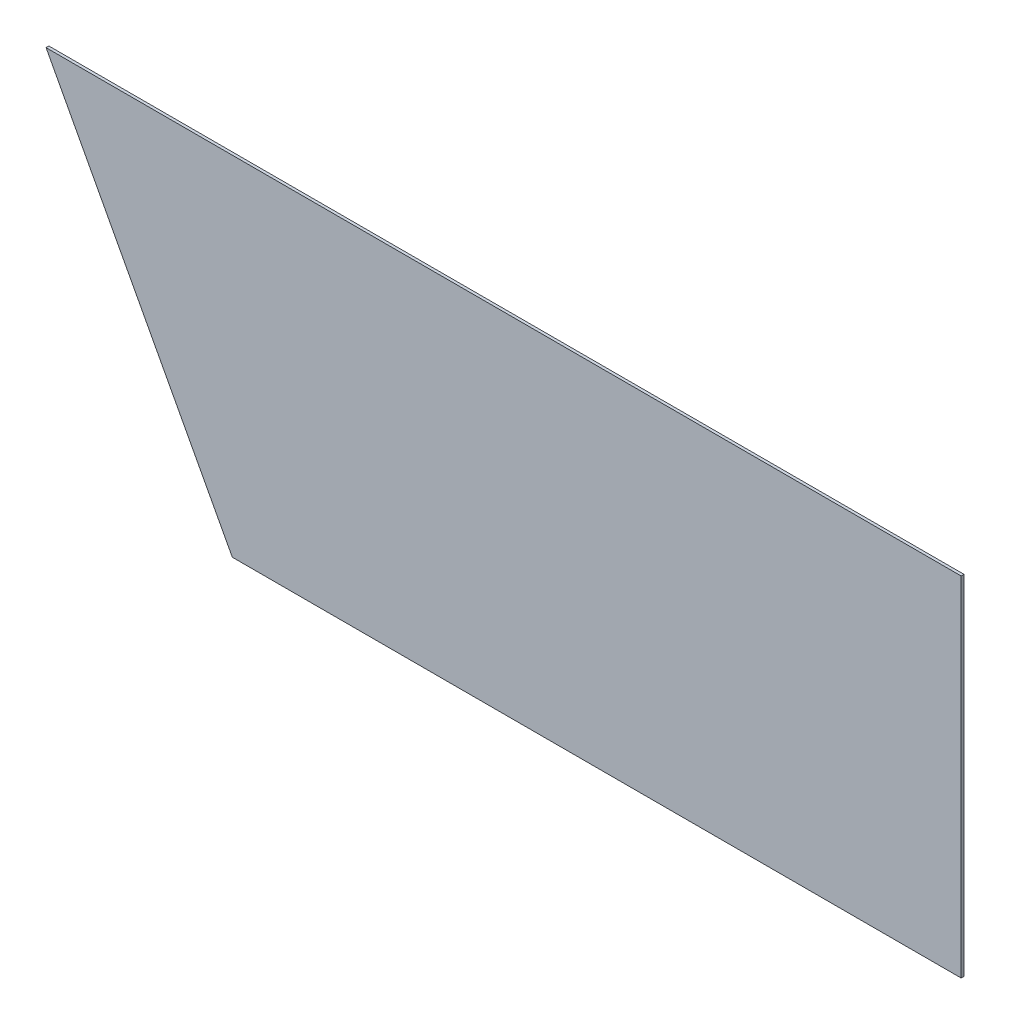
ISO-10303-21;
HEADER;
FILE_DESCRIPTION(('STEP AP214'),'2;1');
FILE_NAME('part.step','',(''),(''),'','','');
FILE_SCHEMA(('AUTOMOTIVE_DESIGN { 1 0 10303 214 1 1 1 1 }'));
ENDSEC;
DATA;
#1=APPLICATION_CONTEXT('core data for automotive mechanical design processes');
#2=APPLICATION_PROTOCOL_DEFINITION('international standard','automotive_design',2000,#1);
#3=PRODUCT_CONTEXT('',#1,'mechanical');
#4=PRODUCT('Part','Part','',(#3));
#5=PRODUCT_RELATED_PRODUCT_CATEGORY('part','',(#4));
#6=PRODUCT_DEFINITION_FORMATION('','',#4);
#7=PRODUCT_DEFINITION_CONTEXT('part definition',#1,'design');
#8=PRODUCT_DEFINITION('design','',#6,#7);
#9=PRODUCT_DEFINITION_SHAPE('','',#8);
#10=(LENGTH_UNIT() NAMED_UNIT(*) SI_UNIT(.MILLI.,.METRE.));
#11=(NAMED_UNIT(*) PLANE_ANGLE_UNIT() SI_UNIT($,.RADIAN.));
#12=(NAMED_UNIT(*) SI_UNIT($,.STERADIAN.) SOLID_ANGLE_UNIT());
#13=UNCERTAINTY_MEASURE_WITH_UNIT(LENGTH_MEASURE(1.E-05),#10,'distance_accuracy_value','');
#14=(GEOMETRIC_REPRESENTATION_CONTEXT(3) GLOBAL_UNCERTAINTY_ASSIGNED_CONTEXT((#13)) GLOBAL_UNIT_ASSIGNED_CONTEXT((#10,
#11,#12)) REPRESENTATION_CONTEXT('',''));
#15=CARTESIAN_POINT('',(0.,0.,0.));
#16=DIRECTION('',(0.,0.,1.));
#17=DIRECTION('',(1.,0.,0.));
#18=AXIS2_PLACEMENT_3D('',#15,#16,#17);
#19=CARTESIAN_POINT('',(5.65,-2.15,0.035));
#20=DIRECTION('',(-1.,0.,0.));
#21=DIRECTION('',(0.,0.,1.));
#22=AXIS2_PLACEMENT_3D('',#19,#20,#21);
#23=PLANE('',#22);
#24=DIRECTION('',(0.,1.,0.));
#25=VECTOR('',#24,1.);
#26=CARTESIAN_POINT('',(5.65,-2.15,0.));
#27=LINE('',#26,#25);
#28=CARTESIAN_POINT('',(5.65,-2.15,0.));
#29=VERTEX_POINT('',#28);
#30=CARTESIAN_POINT('',(5.65,2.15,0.));
#31=VERTEX_POINT('',#30);
#32=EDGE_CURVE('E113',#29,#31,#27,.T.);
#33=ORIENTED_EDGE('',*,*,#32,.T.);
#34=DIRECTION('',(0.,0.,-1.));
#35=VECTOR('',#34,1.);
#36=CARTESIAN_POINT('',(5.65,2.15,0.035));
#37=LINE('',#36,#35);
#38=CARTESIAN_POINT('',(5.65,2.15,0.035));
#39=VERTEX_POINT('',#38);
#40=EDGE_CURVE('E11',#39,#31,#37,.T.);
#41=ORIENTED_EDGE('',*,*,#40,.F.);
#42=DIRECTION('',(0.,1.,0.));
#43=VECTOR('',#42,1.);
#44=CARTESIAN_POINT('',(5.65,-2.15,0.035));
#45=LINE('',#44,#43);
#46=CARTESIAN_POINT('',(5.65,-2.15,0.035));
#47=VERTEX_POINT('',#46);
#48=EDGE_CURVE('E97',#47,#39,#45,.T.);
#49=ORIENTED_EDGE('',*,*,#48,.F.);
#50=DIRECTION('',(0.,0.,-1.));
#51=VECTOR('',#50,1.);
#52=CARTESIAN_POINT('',(5.65,-2.15,0.035));
#53=LINE('',#52,#51);
#54=EDGE_CURVE('E109',#47,#29,#53,.T.);
#55=ORIENTED_EDGE('',*,*,#54,.T.);
#56=EDGE_LOOP('',(#33,#41,#49,#55));
#57=FACE_BOUND('',#56,.T.);
#58=ADVANCED_FACE('F45',(#57),#23,.F.);
#59=CARTESIAN_POINT('',(-5.65,2.15,0.035));
#60=DIRECTION('',(0.,-1.,0.));
#61=DIRECTION('',(0.,0.,-1.));
#62=AXIS2_PLACEMENT_3D('',#59,#60,#61);
#63=PLANE('',#62);
#64=DIRECTION('',(-1.,0.,0.));
#65=VECTOR('',#64,1.);
#66=CARTESIAN_POINT('',(-5.65,2.15,0.));
#67=LINE('',#66,#65);
#68=CARTESIAN_POINT('',(-5.65,2.15,0.));
#69=VERTEX_POINT('',#68);
#70=EDGE_CURVE('E102',#31,#69,#67,.T.);
#71=ORIENTED_EDGE('',*,*,#70,.T.);
#72=DIRECTION('',(0.,0.,-1.));
#73=VECTOR('',#72,1.);
#74=CARTESIAN_POINT('',(-5.65,2.15,0.035));
#75=LINE('',#74,#73);
#76=CARTESIAN_POINT('',(-5.65,2.15,0.035));
#77=VERTEX_POINT('',#76);
#78=EDGE_CURVE('E54',#77,#69,#75,.T.);
#79=ORIENTED_EDGE('',*,*,#78,.F.);
#80=DIRECTION('',(-1.,0.,0.));
#81=VECTOR('',#80,1.);
#82=CARTESIAN_POINT('',(-5.65,2.15,0.035));
#83=LINE('',#82,#81);
#84=EDGE_CURVE('E92',#39,#77,#83,.T.);
#85=ORIENTED_EDGE('',*,*,#84,.F.);
#86=ORIENTED_EDGE('',*,*,#40,.T.);
#87=EDGE_LOOP('',(#71,#79,#85,#86));
#88=FACE_BOUND('',#87,.T.);
#89=ADVANCED_FACE('F101',(#88),#63,.F.);
#90=CARTESIAN_POINT('',(-5.65,2.15,0.035));
#91=DIRECTION('',(0.881784641934691,0.471652250337161,0.));
#92=DIRECTION('',(-0.471652250337161,0.881784641934691,0.));
#93=AXIS2_PLACEMENT_3D('',#90,#91,#92);
#94=PLANE('',#93);
#95=DIRECTION('',(0.471652250337161,-0.881784641934691,0.));
#96=VECTOR('',#95,1.);
#97=CARTESIAN_POINT('',(-5.65,2.15,0.));
#98=LINE('',#97,#96);
#99=CARTESIAN_POINT('',(-3.35,-2.15,0.));
#100=VERTEX_POINT('',#99);
#101=EDGE_CURVE('E79',#69,#100,#98,.T.);
#102=ORIENTED_EDGE('',*,*,#101,.T.);
#103=DIRECTION('',(0.,0.,-1.));
#104=VECTOR('',#103,1.);
#105=CARTESIAN_POINT('',(-3.35,-2.15,0.035));
#106=LINE('',#105,#104);
#107=CARTESIAN_POINT('',(-3.35,-2.15,0.035));
#108=VERTEX_POINT('',#107);
#109=EDGE_CURVE('E104',#108,#100,#106,.T.);
#110=ORIENTED_EDGE('',*,*,#109,.F.);
#111=DIRECTION('',(0.471652250337161,-0.881784641934691,0.));
#112=VECTOR('',#111,1.);
#113=CARTESIAN_POINT('',(-5.65,2.15,0.035));
#114=LINE('',#113,#112);
#115=EDGE_CURVE('E95',#77,#108,#114,.T.);
#116=ORIENTED_EDGE('',*,*,#115,.F.);
#117=ORIENTED_EDGE('',*,*,#78,.T.);
#118=EDGE_LOOP('',(#102,#110,#116,#117));
#119=FACE_BOUND('',#118,.T.);
#120=ADVANCED_FACE('F105',(#119),#94,.F.);
#121=CARTESIAN_POINT('',(-3.35,-2.15,0.035));
#122=DIRECTION('',(0.,1.,0.));
#123=DIRECTION('',(0.,0.,1.));
#124=AXIS2_PLACEMENT_3D('',#121,#122,#123);
#125=PLANE('',#124);
#126=DIRECTION('',(1.,0.,0.));
#127=VECTOR('',#126,1.);
#128=CARTESIAN_POINT('',(-3.35,-2.15,0.));
#129=LINE('',#128,#127);
#130=EDGE_CURVE('E85',#100,#29,#129,.T.);
#131=ORIENTED_EDGE('',*,*,#130,.T.);
#132=ORIENTED_EDGE('',*,*,#54,.F.);
#133=DIRECTION('',(1.,0.,0.));
#134=VECTOR('',#133,1.);
#135=CARTESIAN_POINT('',(-3.35,-2.15,0.035));
#136=LINE('',#135,#134);
#137=EDGE_CURVE('E62',#108,#47,#136,.T.);
#138=ORIENTED_EDGE('',*,*,#137,.F.);
#139=ORIENTED_EDGE('',*,*,#109,.T.);
#140=EDGE_LOOP('',(#131,#132,#138,#139));
#141=FACE_BOUND('',#140,.T.);
#142=ADVANCED_FACE('F126',(#141),#125,.F.);
#143=CARTESIAN_POINT('',(0.,0.,0.035));
#144=DIRECTION('',(0.,0.,-1.));
#145=DIRECTION('',(-1.,0.,0.));
#146=AXIS2_PLACEMENT_3D('',#143,#144,#145);
#147=PLANE('',#146);
#148=ORIENTED_EDGE('',*,*,#48,.T.);
#149=ORIENTED_EDGE('',*,*,#84,.T.);
#150=ORIENTED_EDGE('',*,*,#115,.T.);
#151=ORIENTED_EDGE('',*,*,#137,.T.);
#152=EDGE_LOOP('',(#148,#149,#150,#151));
#153=FACE_BOUND('',#152,.T.);
#154=ADVANCED_FACE('F93',(#153),#147,.F.);
#155=CARTESIAN_POINT('',(0.,0.,0.));
#156=DIRECTION('',(0.,0.,-1.));
#157=DIRECTION('',(-1.,0.,0.));
#158=AXIS2_PLACEMENT_3D('',#155,#156,#157);
#159=PLANE('',#158);
#160=ORIENTED_EDGE('',*,*,#32,.F.);
#161=ORIENTED_EDGE('',*,*,#130,.F.);
#162=ORIENTED_EDGE('',*,*,#101,.F.);
#163=ORIENTED_EDGE('',*,*,#70,.F.);
#164=EDGE_LOOP('',(#160,#161,#162,#163));
#165=FACE_BOUND('',#164,.T.);
#166=ADVANCED_FACE('F129',(#165),#159,.T.);
#167=CLOSED_SHELL('',(#58,#89,#120,#142,#154,#166));
#168=MANIFOLD_SOLID_BREP('B2',#167);
#169=ADVANCED_BREP_SHAPE_REPRESENTATION('',(#18,#168),#14);
#170=SHAPE_DEFINITION_REPRESENTATION(#9,#169);
ENDSEC;
END-ISO-10303-21;
